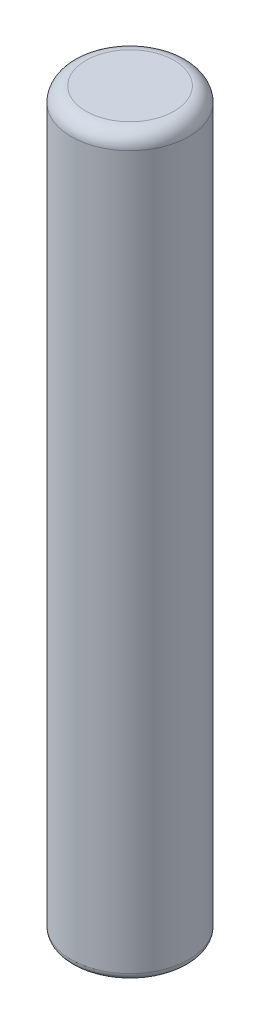
ISO-10303-21;
HEADER;
FILE_DESCRIPTION(('STEP AP214'),'2;1');
FILE_NAME('part.step','',(''),(''),'','','');
FILE_SCHEMA(('AUTOMOTIVE_DESIGN { 1 0 10303 214 1 1 1 1 }'));
ENDSEC;
DATA;
#1=APPLICATION_CONTEXT('core data for automotive mechanical design processes');
#2=APPLICATION_PROTOCOL_DEFINITION('international standard','automotive_design',2000,#1);
#3=PRODUCT_CONTEXT('',#1,'mechanical');
#4=PRODUCT('Part','Part','',(#3));
#5=PRODUCT_RELATED_PRODUCT_CATEGORY('part','',(#4));
#6=PRODUCT_DEFINITION_FORMATION('','',#4);
#7=PRODUCT_DEFINITION_CONTEXT('part definition',#1,'design');
#8=PRODUCT_DEFINITION('design','',#6,#7);
#9=PRODUCT_DEFINITION_SHAPE('','',#8);
#10=(LENGTH_UNIT() NAMED_UNIT(*) SI_UNIT(.MILLI.,.METRE.));
#11=(NAMED_UNIT(*) PLANE_ANGLE_UNIT() SI_UNIT($,.RADIAN.));
#12=(NAMED_UNIT(*) SI_UNIT($,.STERADIAN.) SOLID_ANGLE_UNIT());
#13=UNCERTAINTY_MEASURE_WITH_UNIT(LENGTH_MEASURE(1.E-05),#10,'distance_accuracy_value','');
#14=(GEOMETRIC_REPRESENTATION_CONTEXT(3) GLOBAL_UNCERTAINTY_ASSIGNED_CONTEXT((#13)) GLOBAL_UNIT_ASSIGNED_CONTEXT((#10,
#11,#12)) REPRESENTATION_CONTEXT('',''));
#15=CARTESIAN_POINT('',(0.,0.,0.));
#16=DIRECTION('',(0.,0.,1.));
#17=DIRECTION('',(1.,0.,0.));
#18=AXIS2_PLACEMENT_3D('',#15,#16,#17);
#19=CARTESIAN_POINT('',(3.97719999999458,-23.6996605001345,6.06600010715562));
#20=DIRECTION('',(0.,-1.,0.));
#21=DIRECTION('',(1.,0.,0.));
#22=AXIS2_PLACEMENT_3D('',#19,#20,#21);
#23=PLANE('',#22);
#24=CARTESIAN_POINT('',(3.97719999999457,-23.6996605001345,6.06600010715562));
#25=DIRECTION('',(0.,1.,0.));
#26=DIRECTION('',(-1.,0.,0.));
#27=AXIS2_PLACEMENT_3D('',#24,#25,#26);
#28=CIRCLE('',#27,1.74999999999999);
#29=CARTESIAN_POINT('',(2.22719999999458,-23.6996605001345,6.06600010715565));
#30=VERTEX_POINT('',#29);
#31=CARTESIAN_POINT('',(3.97719999999458,-23.6996605001345,7.81600010715562));
#32=VERTEX_POINT('',#31);
#33=EDGE_CURVE('E45',#30,#32,#28,.T.);
#34=ORIENTED_EDGE('',*,*,#33,.F.);
#35=CARTESIAN_POINT('',(3.97719999999457,-23.6996605001345,6.06600010715562));
#36=DIRECTION('',(0.,1.,0.));
#37=DIRECTION('',(0.,0.,1.));
#38=AXIS2_PLACEMENT_3D('',#35,#36,#37);
#39=CIRCLE('',#38,1.75);
#40=EDGE_CURVE('E48',#32,#30,#39,.T.);
#41=ORIENTED_EDGE('',*,*,#40,.F.);
#42=EDGE_LOOP('',(#34,#41));
#43=FACE_BOUND('',#42,.T.);
#44=ADVANCED_FACE('F16',(#43),#23,.T.);
#45=CARTESIAN_POINT('',(3.97719999999403,1.30033949986547,6.0660001071556));
#46=DIRECTION('',(0.,1.,0.));
#47=DIRECTION('',(-1.,0.,0.));
#48=AXIS2_PLACEMENT_3D('',#45,#46,#47);
#49=PLANE('',#48);
#50=CARTESIAN_POINT('',(3.97719999999403,1.30033949986547,6.0660001071556));
#51=DIRECTION('',(0.,-1.,0.));
#52=DIRECTION('',(-1.,0.,0.));
#53=AXIS2_PLACEMENT_3D('',#50,#51,#52);
#54=CIRCLE('',#53,1.50000000000001);
#55=CARTESIAN_POINT('',(2.47719999999402,1.30033949986543,6.06600010715563));
#56=VERTEX_POINT('',#55);
#57=CARTESIAN_POINT('',(3.97719999999403,1.30033949986547,7.5660001071556));
#58=VERTEX_POINT('',#57);
#59=EDGE_CURVE('E36',#56,#58,#54,.T.);
#60=ORIENTED_EDGE('',*,*,#59,.F.);
#61=CARTESIAN_POINT('',(3.97719999999403,1.30033949986547,6.0660001071556));
#62=DIRECTION('',(0.,-1.,0.));
#63=DIRECTION('',(0.,0.,1.));
#64=AXIS2_PLACEMENT_3D('',#61,#62,#63);
#65=CIRCLE('',#64,1.5);
#66=EDGE_CURVE('E55',#58,#56,#65,.T.);
#67=ORIENTED_EDGE('',*,*,#66,.F.);
#68=EDGE_LOOP('',(#60,#67));
#69=FACE_BOUND('',#68,.T.);
#70=ADVANCED_FACE('F71',(#69),#49,.T.);
#71=CARTESIAN_POINT('',(3.97719999999457,-23.4496605001345,6.06600010715562));
#72=DIRECTION('',(0.,-1.,0.));
#73=DIRECTION('',(0.,0.,-1.));
#74=AXIS2_PLACEMENT_3D('',#71,#72,#73);
#75=TOROIDAL_SURFACE('',#74,1.75,0.25);
#76=CARTESIAN_POINT('',(3.97719999999457,-23.4496605001346,6.06600010715562));
#77=DIRECTION('',(0.,-1.,0.));
#78=DIRECTION('',(1.,0.,0.));
#79=AXIS2_PLACEMENT_3D('',#76,#77,#78);
#80=CIRCLE('',#79,2.);
#81=CARTESIAN_POINT('',(5.97719999999457,-23.4496605001345,6.06600010715562));
#82=VERTEX_POINT('',#81);
#83=EDGE_CURVE('E28',#82,#82,#80,.F.);
#84=ORIENTED_EDGE('',*,*,#83,.F.);
#85=EDGE_LOOP('',(#84));
#86=FACE_BOUND('',#85,.T.);
#87=ORIENTED_EDGE('',*,*,#33,.T.);
#88=ORIENTED_EDGE('',*,*,#40,.T.);
#89=EDGE_LOOP('',(#87,#88));
#90=FACE_BOUND('',#89,.T.);
#91=ADVANCED_FACE('F54',(#86,#90),#75,.T.);
#92=CARTESIAN_POINT('',(3.97719999999404,0.800339499865466,6.0660001071556));
#93=DIRECTION('',(0.,-1.,0.));
#94=DIRECTION('',(0.,0.,-1.));
#95=AXIS2_PLACEMENT_3D('',#92,#93,#94);
#96=TOROIDAL_SURFACE('',#95,1.5,0.5);
#97=ORIENTED_EDGE('',*,*,#59,.T.);
#98=ORIENTED_EDGE('',*,*,#66,.T.);
#99=EDGE_LOOP('',(#97,#98));
#100=FACE_BOUND('',#99,.T.);
#101=CARTESIAN_POINT('',(3.97719999999403,0.800339499865466,6.0660001071556));
#102=DIRECTION('',(0.,-1.,0.));
#103=DIRECTION('',(1.,0.,0.));
#104=AXIS2_PLACEMENT_3D('',#101,#102,#103);
#105=CIRCLE('',#104,2.);
#106=CARTESIAN_POINT('',(5.97719999999403,0.80033949986551,6.0660001071556));
#107=VERTEX_POINT('',#106);
#108=EDGE_CURVE('E11',#107,#107,#105,.T.);
#109=ORIENTED_EDGE('',*,*,#108,.F.);
#110=EDGE_LOOP('',(#109));
#111=FACE_BOUND('',#110,.T.);
#112=ADVANCED_FACE('F70',(#100,#111),#96,.T.);
#113=CARTESIAN_POINT('',(3.97719999999432,-12.1996605001345,6.06600010715561));
#114=DIRECTION('',(0.,-1.,0.));
#115=DIRECTION('',(1.,0.,0.));
#116=AXIS2_PLACEMENT_3D('',#113,#114,#115);
#117=CYLINDRICAL_SURFACE('',#116,2.);
#118=ORIENTED_EDGE('',*,*,#108,.T.);
#119=EDGE_LOOP('',(#118));
#120=FACE_BOUND('',#119,.T.);
#121=ORIENTED_EDGE('',*,*,#83,.T.);
#122=EDGE_LOOP('',(#121));
#123=FACE_BOUND('',#122,.T.);
#124=ADVANCED_FACE('F128',(#120,#123),#117,.T.);
#125=CLOSED_SHELL('',(#44,#70,#91,#112,#124));
#126=MANIFOLD_SOLID_BREP('B1',#125);
#127=ADVANCED_BREP_SHAPE_REPRESENTATION('',(#18,#126),#14);
#128=SHAPE_DEFINITION_REPRESENTATION(#9,#127);
ENDSEC;
END-ISO-10303-21;
